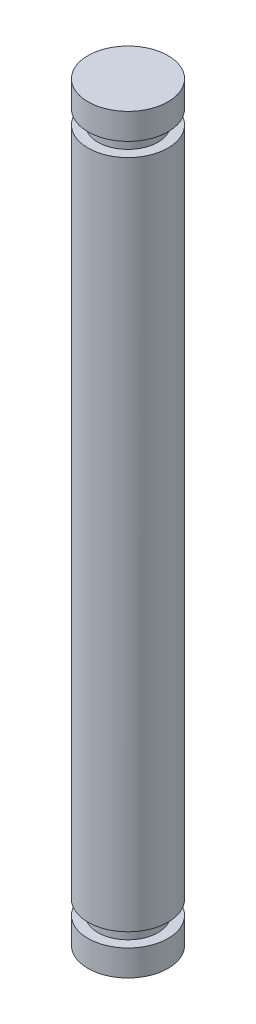
ISO-10303-21;
HEADER;
FILE_DESCRIPTION(('STEP AP214'),'2;1');
FILE_NAME('part.step','',(''),(''),'','','');
FILE_SCHEMA(('AUTOMOTIVE_DESIGN { 1 0 10303 214 1 1 1 1 }'));
ENDSEC;
DATA;
#1=APPLICATION_CONTEXT('core data for automotive mechanical design processes');
#2=APPLICATION_PROTOCOL_DEFINITION('international standard','automotive_design',2000,#1);
#3=PRODUCT_CONTEXT('',#1,'mechanical');
#4=PRODUCT('Part','Part','',(#3));
#5=PRODUCT_RELATED_PRODUCT_CATEGORY('part','',(#4));
#6=PRODUCT_DEFINITION_FORMATION('','',#4);
#7=PRODUCT_DEFINITION_CONTEXT('part definition',#1,'design');
#8=PRODUCT_DEFINITION('design','',#6,#7);
#9=PRODUCT_DEFINITION_SHAPE('','',#8);
#10=(LENGTH_UNIT() NAMED_UNIT(*) SI_UNIT(.MILLI.,.METRE.));
#11=(NAMED_UNIT(*) PLANE_ANGLE_UNIT() SI_UNIT($,.RADIAN.));
#12=(NAMED_UNIT(*) SI_UNIT($,.STERADIAN.) SOLID_ANGLE_UNIT());
#13=UNCERTAINTY_MEASURE_WITH_UNIT(LENGTH_MEASURE(1.E-05),#10,'distance_accuracy_value','');
#14=(GEOMETRIC_REPRESENTATION_CONTEXT(3) GLOBAL_UNCERTAINTY_ASSIGNED_CONTEXT((#13)) GLOBAL_UNIT_ASSIGNED_CONTEXT((#10,
#11,#12)) REPRESENTATION_CONTEXT('',''));
#15=CARTESIAN_POINT('',(0.,0.,0.));
#16=DIRECTION('',(0.,0.,1.));
#17=DIRECTION('',(1.,0.,0.));
#18=AXIS2_PLACEMENT_3D('',#15,#16,#17);
#19=CARTESIAN_POINT('',(0.,37.5,0.));
#20=DIRECTION('',(0.,-1.,0.));
#21=DIRECTION('',(0.,0.,-1.));
#22=AXIS2_PLACEMENT_3D('',#19,#20,#21);
#23=CYLINDRICAL_SURFACE('',#22,2.);
#24=CARTESIAN_POINT('',(0.,35.5,0.));
#25=DIRECTION('',(0.,1.,0.));
#26=DIRECTION('',(0.,0.,1.));
#27=AXIS2_PLACEMENT_3D('',#24,#25,#26);
#28=CIRCLE('',#27,2.);
#29=CARTESIAN_POINT('',(0.,35.5,2.));
#30=VERTEX_POINT('',#29);
#31=EDGE_CURVE('E56',#30,#30,#28,.T.);
#32=ORIENTED_EDGE('',*,*,#31,.F.);
#33=EDGE_LOOP('',(#32));
#34=FACE_BOUND('',#33,.T.);
#35=CARTESIAN_POINT('',(0.,2.,0.));
#36=DIRECTION('',(0.,-1.,0.));
#37=DIRECTION('',(0.,0.,-1.));
#38=AXIS2_PLACEMENT_3D('',#35,#36,#37);
#39=CIRCLE('',#38,2.);
#40=CARTESIAN_POINT('',(0.,2.,-2.));
#41=VERTEX_POINT('',#40);
#42=EDGE_CURVE('E70',#41,#41,#39,.T.);
#43=ORIENTED_EDGE('',*,*,#42,.F.);
#44=EDGE_LOOP('',(#43));
#45=FACE_BOUND('',#44,.T.);
#46=ADVANCED_FACE('F43',(#34,#45),#23,.T.);
#47=CARTESIAN_POINT('',(0.,35.5,0.));
#48=DIRECTION('',(0.,1.,0.));
#49=DIRECTION('',(0.,0.,1.));
#50=AXIS2_PLACEMENT_3D('',#47,#48,#49);
#51=PLANE('',#50);
#52=CARTESIAN_POINT('',(0.,35.5,0.));
#53=DIRECTION('',(0.,1.,0.));
#54=DIRECTION('',(0.,0.,1.));
#55=AXIS2_PLACEMENT_3D('',#52,#53,#54);
#56=CIRCLE('',#55,1.5);
#57=CARTESIAN_POINT('',(0.,35.5,1.5));
#58=VERTEX_POINT('',#57);
#59=EDGE_CURVE('E62',#58,#58,#56,.T.);
#60=ORIENTED_EDGE('',*,*,#59,.F.);
#61=EDGE_LOOP('',(#60));
#62=FACE_BOUND('',#61,.T.);
#63=ORIENTED_EDGE('',*,*,#31,.T.);
#64=EDGE_LOOP('',(#63));
#65=FACE_BOUND('',#64,.T.);
#66=ADVANCED_FACE('F101',(#62,#65),#51,.T.);
#67=CARTESIAN_POINT('',(0.,36.2,0.));
#68=DIRECTION('',(0.,1.,0.));
#69=DIRECTION('',(0.,0.,1.));
#70=AXIS2_PLACEMENT_3D('',#67,#68,#69);
#71=PLANE('',#70);
#72=CARTESIAN_POINT('',(0.,36.2,0.));
#73=DIRECTION('',(0.,1.,0.));
#74=DIRECTION('',(0.,0.,1.));
#75=AXIS2_PLACEMENT_3D('',#72,#73,#74);
#76=CIRCLE('',#75,1.5);
#77=CARTESIAN_POINT('',(0.,36.2,1.5));
#78=VERTEX_POINT('',#77);
#79=EDGE_CURVE('E66',#78,#78,#76,.T.);
#80=ORIENTED_EDGE('',*,*,#79,.T.);
#81=EDGE_LOOP('',(#80));
#82=FACE_BOUND('',#81,.T.);
#83=CARTESIAN_POINT('',(0.,36.2,0.));
#84=DIRECTION('',(0.,1.,0.));
#85=DIRECTION('',(0.,0.,1.));
#86=AXIS2_PLACEMENT_3D('',#83,#84,#85);
#87=CIRCLE('',#86,2.);
#88=CARTESIAN_POINT('',(0.,36.2,2.));
#89=VERTEX_POINT('',#88);
#90=EDGE_CURVE('E58',#89,#89,#87,.T.);
#91=ORIENTED_EDGE('',*,*,#90,.F.);
#92=EDGE_LOOP('',(#91));
#93=FACE_BOUND('',#92,.T.);
#94=ADVANCED_FACE('F108',(#82,#93),#71,.F.);
#95=CARTESIAN_POINT('',(0.,35.5,0.));
#96=DIRECTION('',(0.,1.,0.));
#97=DIRECTION('',(0.,0.,1.));
#98=AXIS2_PLACEMENT_3D('',#95,#96,#97);
#99=CYLINDRICAL_SURFACE('',#98,1.5);
#100=ORIENTED_EDGE('',*,*,#59,.T.);
#101=EDGE_LOOP('',(#100));
#102=FACE_BOUND('',#101,.T.);
#103=ORIENTED_EDGE('',*,*,#79,.F.);
#104=EDGE_LOOP('',(#103));
#105=FACE_BOUND('',#104,.T.);
#106=ADVANCED_FACE('F121',(#102,#105),#99,.T.);
#107=CARTESIAN_POINT('',(0.,37.5,0.));
#108=DIRECTION('',(0.,1.,0.));
#109=DIRECTION('',(0.,0.,1.));
#110=AXIS2_PLACEMENT_3D('',#107,#108,#109);
#111=PLANE('',#110);
#112=CARTESIAN_POINT('',(0.,37.5,0.));
#113=DIRECTION('',(0.,1.,0.));
#114=DIRECTION('',(0.,0.,1.));
#115=AXIS2_PLACEMENT_3D('',#112,#113,#114);
#116=CIRCLE('',#115,2.);
#117=CARTESIAN_POINT('',(0.,37.5,2.));
#118=VERTEX_POINT('',#117);
#119=EDGE_CURVE('E10',#118,#118,#116,.T.);
#120=ORIENTED_EDGE('',*,*,#119,.T.);
#121=EDGE_LOOP('',(#120));
#122=FACE_BOUND('',#121,.T.);
#123=ADVANCED_FACE('F115',(#122),#111,.T.);
#124=ORIENTED_EDGE('',*,*,#90,.T.);
#125=EDGE_LOOP('',(#124));
#126=FACE_BOUND('',#125,.T.);
#127=ORIENTED_EDGE('',*,*,#119,.F.);
#128=EDGE_LOOP('',(#127));
#129=FACE_BOUND('',#128,.T.);
#130=ADVANCED_FACE('F45',(#126,#129),#23,.T.);
#131=CARTESIAN_POINT('',(0.,2.,0.));
#132=DIRECTION('',(0.,-1.,0.));
#133=DIRECTION('',(0.,0.,-1.));
#134=AXIS2_PLACEMENT_3D('',#131,#132,#133);
#135=PLANE('',#134);
#136=CARTESIAN_POINT('',(0.,2.,0.));
#137=DIRECTION('',(0.,-1.,0.));
#138=DIRECTION('',(0.,0.,-1.));
#139=AXIS2_PLACEMENT_3D('',#136,#137,#138);
#140=CIRCLE('',#139,1.5);
#141=CARTESIAN_POINT('',(0.,2.,-1.5));
#142=VERTEX_POINT('',#141);
#143=EDGE_CURVE('E78',#142,#142,#140,.T.);
#144=ORIENTED_EDGE('',*,*,#143,.F.);
#145=EDGE_LOOP('',(#144));
#146=FACE_BOUND('',#145,.T.);
#147=ORIENTED_EDGE('',*,*,#42,.T.);
#148=EDGE_LOOP('',(#147));
#149=FACE_BOUND('',#148,.T.);
#150=ADVANCED_FACE('F93',(#146,#149),#135,.T.);
#151=CARTESIAN_POINT('',(0.,1.3,0.));
#152=DIRECTION('',(0.,-1.,0.));
#153=DIRECTION('',(0.,0.,-1.));
#154=AXIS2_PLACEMENT_3D('',#151,#152,#153);
#155=PLANE('',#154);
#156=CARTESIAN_POINT('',(0.,1.3,0.));
#157=DIRECTION('',(0.,-1.,0.));
#158=DIRECTION('',(0.,0.,-1.));
#159=AXIS2_PLACEMENT_3D('',#156,#157,#158);
#160=CIRCLE('',#159,1.5);
#161=CARTESIAN_POINT('',(0.,1.3,-1.5));
#162=VERTEX_POINT('',#161);
#163=EDGE_CURVE('E82',#162,#162,#160,.T.);
#164=ORIENTED_EDGE('',*,*,#163,.T.);
#165=EDGE_LOOP('',(#164));
#166=FACE_BOUND('',#165,.T.);
#167=CARTESIAN_POINT('',(0.,1.3,0.));
#168=DIRECTION('',(0.,-1.,0.));
#169=DIRECTION('',(0.,0.,-1.));
#170=AXIS2_PLACEMENT_3D('',#167,#168,#169);
#171=CIRCLE('',#170,2.);
#172=CARTESIAN_POINT('',(0.,1.3,-2.));
#173=VERTEX_POINT('',#172);
#174=EDGE_CURVE('E74',#173,#173,#171,.T.);
#175=ORIENTED_EDGE('',*,*,#174,.F.);
#176=EDGE_LOOP('',(#175));
#177=FACE_BOUND('',#176,.T.);
#178=ADVANCED_FACE('F96',(#166,#177),#155,.F.);
#179=CARTESIAN_POINT('',(0.,2.,0.));
#180=DIRECTION('',(0.,-1.,0.));
#181=DIRECTION('',(0.,0.,-1.));
#182=AXIS2_PLACEMENT_3D('',#179,#180,#181);
#183=CYLINDRICAL_SURFACE('',#182,1.5);
#184=ORIENTED_EDGE('',*,*,#143,.T.);
#185=EDGE_LOOP('',(#184));
#186=FACE_BOUND('',#185,.T.);
#187=ORIENTED_EDGE('',*,*,#163,.F.);
#188=EDGE_LOOP('',(#187));
#189=FACE_BOUND('',#188,.T.);
#190=ADVANCED_FACE('F90',(#186,#189),#183,.T.);
#191=CARTESIAN_POINT('',(0.,0.,0.));
#192=DIRECTION('',(0.,1.,0.));
#193=DIRECTION('',(0.,0.,1.));
#194=AXIS2_PLACEMENT_3D('',#191,#192,#193);
#195=PLANE('',#194);
#196=CARTESIAN_POINT('',(0.,0.,0.));
#197=DIRECTION('',(0.,1.,0.));
#198=DIRECTION('',(0.,0.,1.));
#199=AXIS2_PLACEMENT_3D('',#196,#197,#198);
#200=CIRCLE('',#199,2.);
#201=CARTESIAN_POINT('',(0.,0.,2.));
#202=VERTEX_POINT('',#201);
#203=EDGE_CURVE('E47',#202,#202,#200,.T.);
#204=ORIENTED_EDGE('',*,*,#203,.F.);
#205=EDGE_LOOP('',(#204));
#206=FACE_BOUND('',#205,.T.);
#207=ADVANCED_FACE('F113',(#206),#195,.F.);
#208=ORIENTED_EDGE('',*,*,#174,.T.);
#209=EDGE_LOOP('',(#208));
#210=FACE_BOUND('',#209,.T.);
#211=ORIENTED_EDGE('',*,*,#203,.T.);
#212=EDGE_LOOP('',(#211));
#213=FACE_BOUND('',#212,.T.);
#214=ADVANCED_FACE('F103',(#210,#213),#23,.T.);
#215=CLOSED_SHELL('',(#46,#66,#94,#106,#123,#130,#150,#178,#190,#207,#214));
#216=MANIFOLD_SOLID_BREP('B2',#215);
#217=ADVANCED_BREP_SHAPE_REPRESENTATION('',(#18,#216),#14);
#218=SHAPE_DEFINITION_REPRESENTATION(#9,#217);
ENDSEC;
END-ISO-10303-21;
